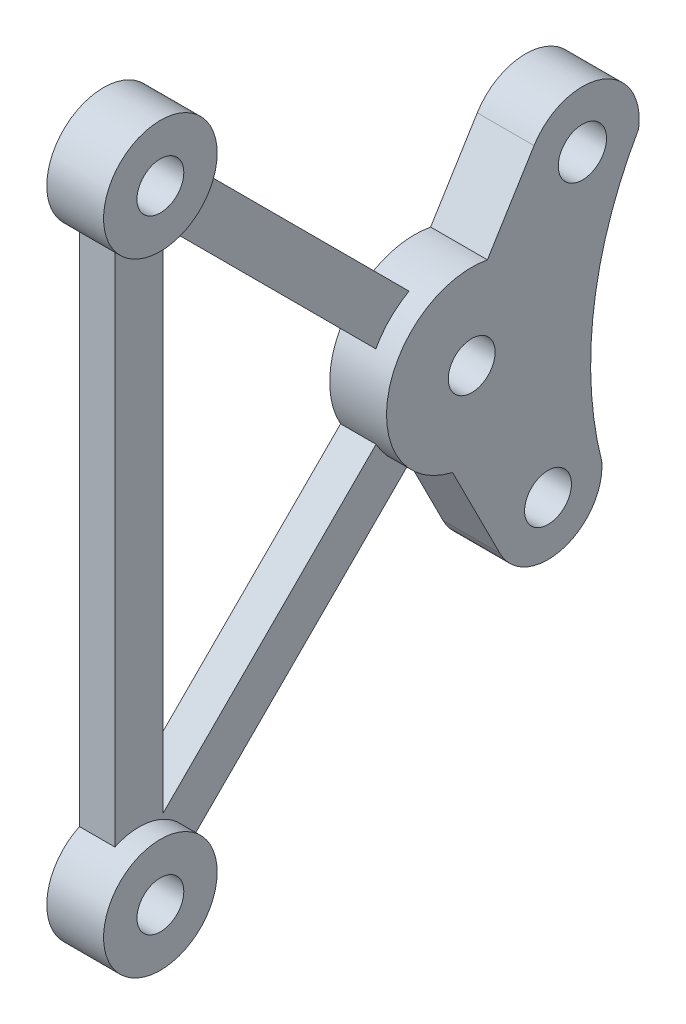
ISO-10303-21;
HEADER;
FILE_DESCRIPTION(('STEP AP214'),'2;1');
FILE_NAME('part.step','',(''),(''),'','','');
FILE_SCHEMA(('AUTOMOTIVE_DESIGN { 1 0 10303 214 1 1 1 1 }'));
ENDSEC;
DATA;
#1=APPLICATION_CONTEXT('core data for automotive mechanical design processes');
#2=APPLICATION_PROTOCOL_DEFINITION('international standard','automotive_design',2000,#1);
#3=PRODUCT_CONTEXT('',#1,'mechanical');
#4=PRODUCT('Part','Part','',(#3));
#5=PRODUCT_RELATED_PRODUCT_CATEGORY('part','',(#4));
#6=PRODUCT_DEFINITION_FORMATION('','',#4);
#7=PRODUCT_DEFINITION_CONTEXT('part definition',#1,'design');
#8=PRODUCT_DEFINITION('design','',#6,#7);
#9=PRODUCT_DEFINITION_SHAPE('','',#8);
#10=(LENGTH_UNIT() NAMED_UNIT(*) SI_UNIT(.MILLI.,.METRE.));
#11=(NAMED_UNIT(*) PLANE_ANGLE_UNIT() SI_UNIT($,.RADIAN.));
#12=(NAMED_UNIT(*) SI_UNIT($,.STERADIAN.) SOLID_ANGLE_UNIT());
#13=UNCERTAINTY_MEASURE_WITH_UNIT(LENGTH_MEASURE(1.E-05),#10,'distance_accuracy_value','');
#14=(GEOMETRIC_REPRESENTATION_CONTEXT(3) GLOBAL_UNCERTAINTY_ASSIGNED_CONTEXT((#13)) GLOBAL_UNIT_ASSIGNED_CONTEXT((#10,
#11,#12)) REPRESENTATION_CONTEXT('',''));
#15=CARTESIAN_POINT('',(0.,0.,0.));
#16=DIRECTION('',(0.,0.,1.));
#17=DIRECTION('',(1.,0.,0.));
#18=AXIS2_PLACEMENT_3D('',#15,#16,#17);
#19=CARTESIAN_POINT('',(7.7,0.,0.));
#20=DIRECTION('',(-1.,0.,0.));
#21=DIRECTION('',(0.,0.,1.));
#22=AXIS2_PLACEMENT_3D('',#19,#20,#21);
#23=PLANE('',#22);
#24=DIRECTION('',(0.,0.851077167042886,-0.525040622940982));
#25=VECTOR('',#24,1.);
#26=CARTESIAN_POINT('',(7.7,15.3011018850537,24.8026874035418));
#27=LINE('',#26,#25);
#28=CARTESIAN_POINT('',(7.7,32.4187106533808,14.242610927504));
#29=VERTEX_POINT('',#28);
#30=CARTESIAN_POINT('',(7.7,37.7439659027633,10.9573913942737));
#31=VERTEX_POINT('',#30);
#32=EDGE_CURVE('E163',#29,#31,#27,.T.);
#33=ORIENTED_EDGE('',*,*,#32,.T.);
#34=CARTESIAN_POINT('',(7.7,35.6438034109994,7.55308272610218));
#35=DIRECTION('',(-1.,0.,0.));
#36=DIRECTION('',(0.,0.,1.));
#37=AXIS2_PLACEMENT_3D('',#34,#35,#36);
#38=CIRCLE('',#37,4.00000000000001);
#39=CARTESIAN_POINT('',(7.7,35.0777791166732,3.59333317616438));
#40=VERTEX_POINT('',#39);
#41=EDGE_CURVE('E153',#31,#40,#38,.T.);
#42=ORIENTED_EDGE('',*,*,#41,.T.);
#43=CARTESIAN_POINT('',(7.7,22.3796583886342,-18.5641875375977));
#44=DIRECTION('',(-1.,0.,0.));
#45=DIRECTION('',(0.,0.,1.));
#46=AXIS2_PLACEMENT_3D('',#43,#44,#45);
#47=CIRCLE('',#46,25.5381674010617);
#48=CARTESIAN_POINT('',(7.7,16.1061997343442,6.19145244034602));
#49=VERTEX_POINT('',#48);
#50=EDGE_CURVE('E161',#40,#49,#47,.F.);
#51=ORIENTED_EDGE('',*,*,#50,.T.);
#52=CARTESIAN_POINT('',(7.7,15.7921957632189,9.97602858641019));
#53=DIRECTION('',(-1.,0.,0.));
#54=DIRECTION('',(0.,0.,1.));
#55=AXIS2_PLACEMENT_3D('',#52,#53,#54);
#56=CIRCLE('',#55,3.79758016363584);
#57=CARTESIAN_POINT('',(7.7,14.0804677214004,13.3659551652748));
#58=VERTEX_POINT('',#57);
#59=EDGE_CURVE('E165',#58,#49,#56,.F.);
#60=ORIENTED_EDGE('',*,*,#59,.F.);
#61=DIRECTION('',(0.,0.892654383263649,0.450741779781057));
#62=VECTOR('',#61,1.);
#63=CARTESIAN_POINT('',(7.7,-2.5171780092854,4.98504927707151));
#64=LINE('',#63,#62);
#65=CARTESIAN_POINT('',(7.7,20.6746451220437,16.6956551180057));
#66=VERTEX_POINT('',#65);
#67=EDGE_CURVE('E179',#58,#66,#64,.T.);
#68=ORIENTED_EDGE('',*,*,#67,.T.);
#69=CARTESIAN_POINT('',(7.7,26.5217412045859,15.3497474683058));
#70=DIRECTION('',(-1.,0.,0.));
#71=DIRECTION('',(0.,0.,1.));
#72=AXIS2_PLACEMENT_3D('',#69,#70,#71);
#73=CIRCLE('',#72,6.);
#74=CARTESIAN_POINT('',(7.7,21.2759526233619,18.2620836716142));
#75=VERTEX_POINT('',#74);
#76=EDGE_CURVE('E236',#66,#75,#73,.T.);
#77=ORIENTED_EDGE('',*,*,#76,.T.);
#78=DIRECTION('',(0.,-0.707106781186548,0.707106781186548));
#79=VECTOR('',#78,1.);
#80=CARTESIAN_POINT('',(7.7,19.769018147488,19.769018147488));
#81=LINE('',#80,#79);
#82=CARTESIAN_POINT('',(7.7,6.00659220251767,33.5314440924584));
#83=VERTEX_POINT('',#82);
#84=EDGE_CURVE('E286',#75,#83,#81,.T.);
#85=ORIENTED_EDGE('',*,*,#84,.T.);
#86=CARTESIAN_POINT('',(7.7,4.59674120458586,37.2747474683058));
#87=DIRECTION('',(-1.,0.,0.));
#88=DIRECTION('',(0.,0.,1.));
#89=AXIS2_PLACEMENT_3D('',#86,#87,#88);
#90=CIRCLE('',#89,4.);
#91=CARTESIAN_POINT('',(7.7,8.21751460263219,38.9747474683058));
#92=VERTEX_POINT('',#91);
#93=EDGE_CURVE('E326',#92,#83,#90,.F.);
#94=ORIENTED_EDGE('',*,*,#93,.F.);
#95=DIRECTION('',(0.,-1.,0.));
#96=VECTOR('',#95,1.);
#97=CARTESIAN_POINT('',(7.7,0.,38.9747474683058));
#98=LINE('',#97,#96);
#99=CARTESIAN_POINT('',(7.7,44.8259678065395,38.9747474683058));
#100=VERTEX_POINT('',#99);
#101=EDGE_CURVE('E283',#100,#92,#98,.T.);
#102=ORIENTED_EDGE('',*,*,#101,.F.);
#103=CARTESIAN_POINT('',(7.7,48.4467412045859,37.2747474683058));
#104=DIRECTION('',(-1.,0.,0.));
#105=DIRECTION('',(0.,0.,1.));
#106=AXIS2_PLACEMENT_3D('',#103,#104,#105);
#107=CIRCLE('',#106,4.);
#108=CARTESIAN_POINT('',(7.7,47.036890206654,33.5314440924584));
#109=VERTEX_POINT('',#108);
#110=EDGE_CURVE('E328',#109,#100,#107,.F.);
#111=ORIENTED_EDGE('',*,*,#110,.F.);
#112=DIRECTION('',(0.,-0.707106781186548,-0.707106781186548));
#113=VECTOR('',#112,1.);
#114=CARTESIAN_POINT('',(7.7,6.75272305709782,-6.75272305709782));
#115=LINE('',#114,#113);
#116=CARTESIAN_POINT('',(7.7,31.7675297858098,18.2620836716142));
#117=VERTEX_POINT('',#116);
#118=EDGE_CURVE('E297',#109,#117,#115,.T.);
#119=ORIENTED_EDGE('',*,*,#118,.T.);
#120=EDGE_CURVE('E245',#117,#29,#73,.T.);
#121=ORIENTED_EDGE('',*,*,#120,.T.);
#122=EDGE_LOOP('',(#33,#42,#51,#60,#68,#77,#85,#94,#102,#111,#119,#121));
#123=FACE_BOUND('',#122,.T.);
#124=CARTESIAN_POINT('',(7.7,15.7921957632189,9.97602858641019));
#125=DIRECTION('',(-1.,0.,0.));
#126=DIRECTION('',(0.,0.,1.));
#127=AXIS2_PLACEMENT_3D('',#124,#125,#126);
#128=CIRCLE('',#127,1.65);
#129=CARTESIAN_POINT('',(7.7,15.7921957632189,11.6260285864102));
#130=VERTEX_POINT('',#129);
#131=EDGE_CURVE('E166',#130,#130,#128,.F.);
#132=ORIENTED_EDGE('',*,*,#131,.T.);
#133=EDGE_LOOP('',(#132));
#134=FACE_BOUND('',#133,.T.);
#135=CARTESIAN_POINT('',(7.7,35.6438034109994,7.55308272610218));
#136=DIRECTION('',(-1.,0.,0.));
#137=DIRECTION('',(0.,0.,1.));
#138=AXIS2_PLACEMENT_3D('',#135,#136,#137);
#139=CIRCLE('',#138,1.7);
#140=CARTESIAN_POINT('',(7.7,35.6438034109994,9.25308272610218));
#141=VERTEX_POINT('',#140);
#142=EDGE_CURVE('E171',#141,#141,#139,.F.);
#143=ORIENTED_EDGE('',*,*,#142,.T.);
#144=EDGE_LOOP('',(#143));
#145=FACE_BOUND('',#144,.T.);
#146=CARTESIAN_POINT('',(7.7,4.59674120458586,37.2747474683058));
#147=DIRECTION('',(-1.,0.,0.));
#148=DIRECTION('',(0.,0.,1.));
#149=AXIS2_PLACEMENT_3D('',#146,#147,#148);
#150=CIRCLE('',#149,1.65);
#151=CARTESIAN_POINT('',(7.7,4.59674120458586,35.6247474683058));
#152=VERTEX_POINT('',#151);
#153=EDGE_CURVE('E299',#152,#152,#150,.F.);
#154=ORIENTED_EDGE('',*,*,#153,.T.);
#155=EDGE_LOOP('',(#154));
#156=FACE_BOUND('',#155,.T.);
#157=CARTESIAN_POINT('',(7.7,48.4467412045859,37.2747474683058));
#158=DIRECTION('',(-1.,0.,0.));
#159=DIRECTION('',(0.,0.,1.));
#160=AXIS2_PLACEMENT_3D('',#157,#158,#159);
#161=CIRCLE('',#160,1.65);
#162=CARTESIAN_POINT('',(7.7,48.4467412045859,35.6247474683058));
#163=VERTEX_POINT('',#162);
#164=EDGE_CURVE('E219',#163,#163,#161,.F.);
#165=ORIENTED_EDGE('',*,*,#164,.T.);
#166=EDGE_LOOP('',(#165));
#167=FACE_BOUND('',#166,.T.);
#168=DIRECTION('',(0.,-0.707106781186547,0.707106781186548));
#169=VECTOR('',#168,1.);
#170=CARTESIAN_POINT('',(7.7,22.0858854249335,22.0858854249335));
#171=LINE('',#170,#169);
#172=CARTESIAN_POINT('',(7.7,23.5881125301496,20.5836583197175));
#173=VERTEX_POINT('',#172);
#174=CARTESIAN_POINT('',(7.7,8.59702338156126,35.5747474683058));
#175=VERTEX_POINT('',#174);
#176=EDGE_CURVE('E289',#173,#175,#171,.T.);
#177=ORIENTED_EDGE('',*,*,#176,.F.);
#178=CARTESIAN_POINT('',(7.7,29.4192451738248,20.6037431618941));
#179=VERTEX_POINT('',#178);
#180=EDGE_CURVE('E243',#173,#179,#73,.T.);
#181=ORIENTED_EDGE('',*,*,#180,.T.);
#182=DIRECTION('',(0.,-0.707106781186548,-0.707106781186548));
#183=VECTOR('',#182,1.);
#184=CARTESIAN_POINT('',(7.7,4.40775100596531,-4.40775100596531));
#185=LINE('',#184,#183);
#186=CARTESIAN_POINT('',(7.7,44.3902494802364,35.5747474683058));
#187=VERTEX_POINT('',#186);
#188=EDGE_CURVE('E295',#187,#179,#185,.T.);
#189=ORIENTED_EDGE('',*,*,#188,.F.);
#190=DIRECTION('',(0.,-1.,0.));
#191=VECTOR('',#190,1.);
#192=CARTESIAN_POINT('',(7.7,0.,35.5747474683058));
#193=LINE('',#192,#191);
#194=EDGE_CURVE('E292',#187,#175,#193,.T.);
#195=ORIENTED_EDGE('',*,*,#194,.T.);
#196=EDGE_LOOP('',(#177,#181,#189,#195));
#197=FACE_BOUND('',#196,.T.);
#198=CARTESIAN_POINT('',(7.7,26.5217412045859,15.3497474683058));
#199=DIRECTION('',(-1.,0.,0.));
#200=DIRECTION('',(0.,0.,1.));
#201=AXIS2_PLACEMENT_3D('',#198,#199,#200);
#202=CIRCLE('',#201,1.65);
#203=CARTESIAN_POINT('',(7.7,26.5217412045859,16.9997474683058));
#204=VERTEX_POINT('',#203);
#205=EDGE_CURVE('E252',#204,#204,#202,.T.);
#206=ORIENTED_EDGE('',*,*,#205,.F.);
#207=EDGE_LOOP('',(#206));
#208=FACE_BOUND('',#207,.T.);
#209=ADVANCED_FACE('F41',(#123,#134,#145,#156,#167,#197,#208),#23,.T.);
#210=CARTESIAN_POINT('',(4.,35.6438034109994,7.55308272610218));
#211=DIRECTION('',(-1.,0.,0.));
#212=DIRECTION('',(0.,0.,1.));
#213=AXIS2_PLACEMENT_3D('',#210,#211,#212);
#214=CYLINDRICAL_SURFACE('',#213,4.00000000000001);
#215=ORIENTED_EDGE('',*,*,#41,.F.);
#216=DIRECTION('',(1.,0.,0.));
#217=VECTOR('',#216,1.);
#218=CARTESIAN_POINT('',(-18.8681269811982,37.7439659027633,10.9573913942737));
#219=LINE('',#218,#217);
#220=CARTESIAN_POINT('',(11.7,37.7439659027633,10.9573913942737));
#221=VERTEX_POINT('',#220);
#222=EDGE_CURVE('E156',#31,#221,#219,.T.);
#223=ORIENTED_EDGE('',*,*,#222,.T.);
#224=CARTESIAN_POINT('',(11.7,35.6438034109994,7.55308272610218));
#225=DIRECTION('',(-1.,0.,0.));
#226=DIRECTION('',(0.,0.,1.));
#227=AXIS2_PLACEMENT_3D('',#224,#225,#226);
#228=CIRCLE('',#227,4.00000000000001);
#229=CARTESIAN_POINT('',(11.7,35.0777791166732,3.59333317616438));
#230=VERTEX_POINT('',#229);
#231=EDGE_CURVE('E11',#221,#230,#228,.T.);
#232=ORIENTED_EDGE('',*,*,#231,.T.);
#233=DIRECTION('',(1.,0.,0.));
#234=VECTOR('',#233,1.);
#235=CARTESIAN_POINT('',(-18.8681269811982,35.0777791166732,3.59333317616438));
#236=LINE('',#235,#234);
#237=EDGE_CURVE('E45',#40,#230,#236,.T.);
#238=ORIENTED_EDGE('',*,*,#237,.F.);
#239=EDGE_LOOP('',(#215,#223,#232,#238));
#240=FACE_BOUND('',#239,.T.);
#241=ADVANCED_FACE('F152',(#240),#214,.T.);
#242=CARTESIAN_POINT('',(-15.4235639409025,15.7921957632189,9.97602858641019));
#243=DIRECTION('',(1.,0.,0.));
#244=DIRECTION('',(0.,0.,-1.));
#245=AXIS2_PLACEMENT_3D('',#242,#243,#244);
#246=CYLINDRICAL_SURFACE('',#245,1.65);
#247=CARTESIAN_POINT('',(11.7,15.7921957632189,9.97602858641019));
#248=DIRECTION('',(1.,0.,0.));
#249=DIRECTION('',(0.,0.,-1.));
#250=AXIS2_PLACEMENT_3D('',#247,#248,#249);
#251=CIRCLE('',#250,1.65);
#252=CARTESIAN_POINT('',(11.7,15.7921957632189,8.3260285864102));
#253=VERTEX_POINT('',#252);
#254=EDGE_CURVE('E212',#253,#253,#251,.T.);
#255=ORIENTED_EDGE('',*,*,#254,.T.);
#256=EDGE_LOOP('',(#255));
#257=FACE_BOUND('',#256,.T.);
#258=ORIENTED_EDGE('',*,*,#131,.F.);
#259=EDGE_LOOP('',(#258));
#260=FACE_BOUND('',#259,.T.);
#261=ADVANCED_FACE('F43',(#257,#260),#246,.F.);
#262=CARTESIAN_POINT('',(-15.4235639409025,-2.5171780092854,4.98504927707151));
#263=DIRECTION('',(0.,0.450741779781057,-0.892654383263649));
#264=DIRECTION('',(0.,0.892654383263649,0.450741779781057));
#265=AXIS2_PLACEMENT_3D('',#262,#263,#264);
#266=PLANE('',#265);
#267=ORIENTED_EDGE('',*,*,#67,.F.);
#268=DIRECTION('',(1.,0.,0.));
#269=VECTOR('',#268,1.);
#270=CARTESIAN_POINT('',(-15.4235639409025,14.0804677214004,13.3659551652748));
#271=LINE('',#270,#269);
#272=CARTESIAN_POINT('',(11.7,14.0804677214004,13.3659551652748));
#273=VERTEX_POINT('',#272);
#274=EDGE_CURVE('E178',#58,#273,#271,.T.);
#275=ORIENTED_EDGE('',*,*,#274,.T.);
#276=DIRECTION('',(0.,0.892654383263649,0.450741779781057));
#277=VECTOR('',#276,1.);
#278=CARTESIAN_POINT('',(11.7,-2.5171780092854,4.98504927707151));
#279=LINE('',#278,#277);
#280=CARTESIAN_POINT('',(11.7,20.6746451220437,16.6956551180057));
#281=VERTEX_POINT('',#280);
#282=EDGE_CURVE('E180',#273,#281,#279,.T.);
#283=ORIENTED_EDGE('',*,*,#282,.T.);
#284=DIRECTION('',(1.,0.,0.));
#285=VECTOR('',#284,1.);
#286=CARTESIAN_POINT('',(-15.4235639409025,20.6746451220437,16.6956551180057));
#287=LINE('',#286,#285);
#288=EDGE_CURVE('E214',#66,#281,#287,.T.);
#289=ORIENTED_EDGE('',*,*,#288,.F.);
#290=EDGE_LOOP('',(#267,#275,#283,#289));
#291=FACE_BOUND('',#290,.T.);
#292=ADVANCED_FACE('F200',(#291),#266,.F.);
#293=CARTESIAN_POINT('',(-15.4235639409025,15.7921957632189,9.97602858641019));
#294=DIRECTION('',(1.,0.,0.));
#295=DIRECTION('',(0.,0.,-1.));
#296=AXIS2_PLACEMENT_3D('',#293,#294,#295);
#297=CYLINDRICAL_SURFACE('',#296,3.79758016363584);
#298=ORIENTED_EDGE('',*,*,#274,.F.);
#299=ORIENTED_EDGE('',*,*,#59,.T.);
#300=DIRECTION('',(1.,0.,0.));
#301=VECTOR('',#300,1.);
#302=CARTESIAN_POINT('',(7.85,16.1061997343442,6.19145244034602));
#303=LINE('',#302,#301);
#304=CARTESIAN_POINT('',(11.7,16.1061997343441,6.191452440346));
#305=VERTEX_POINT('',#304);
#306=EDGE_CURVE('E169',#305,#49,#303,.F.);
#307=ORIENTED_EDGE('',*,*,#306,.F.);
#308=CARTESIAN_POINT('',(11.7,15.7921957632189,9.97602858641019));
#309=DIRECTION('',(1.,0.,0.));
#310=DIRECTION('',(0.,0.,-1.));
#311=AXIS2_PLACEMENT_3D('',#308,#309,#310);
#312=CIRCLE('',#311,3.79758016363584);
#313=EDGE_CURVE('E215',#273,#305,#312,.T.);
#314=ORIENTED_EDGE('',*,*,#313,.F.);
#315=EDGE_LOOP('',(#298,#299,#307,#314));
#316=FACE_BOUND('',#315,.T.);
#317=ADVANCED_FACE('F206',(#316),#297,.T.);
#318=CARTESIAN_POINT('',(-18.8681269811982,35.6438034109994,7.55308272610218));
#319=DIRECTION('',(1.,0.,0.));
#320=DIRECTION('',(0.,0.,-1.));
#321=AXIS2_PLACEMENT_3D('',#318,#319,#320);
#322=CYLINDRICAL_SURFACE('',#321,1.7);
#323=CARTESIAN_POINT('',(11.7,35.6438034109994,7.55308272610218));
#324=DIRECTION('',(-1.,0.,0.));
#325=DIRECTION('',(0.,0.,1.));
#326=AXIS2_PLACEMENT_3D('',#323,#324,#325);
#327=CIRCLE('',#326,1.7);
#328=CARTESIAN_POINT('',(11.7,35.6438034109994,9.25308272610218));
#329=VERTEX_POINT('',#328);
#330=EDGE_CURVE('E155',#329,#329,#327,.T.);
#331=ORIENTED_EDGE('',*,*,#330,.F.);
#332=EDGE_LOOP('',(#331));
#333=FACE_BOUND('',#332,.T.);
#334=ORIENTED_EDGE('',*,*,#142,.F.);
#335=EDGE_LOOP('',(#334));
#336=FACE_BOUND('',#335,.T.);
#337=ADVANCED_FACE('F366',(#333,#336),#322,.F.);
#338=CARTESIAN_POINT('',(-18.8681269811982,15.3011018850537,24.8026874035418));
#339=DIRECTION('',(0.,-0.525040622940982,-0.851077167042886));
#340=DIRECTION('',(0.,0.851077167042886,-0.525040622940982));
#341=AXIS2_PLACEMENT_3D('',#338,#339,#340);
#342=PLANE('',#341);
#343=ORIENTED_EDGE('',*,*,#222,.F.);
#344=ORIENTED_EDGE('',*,*,#32,.F.);
#345=DIRECTION('',(1.,0.,0.));
#346=VECTOR('',#345,1.);
#347=CARTESIAN_POINT('',(-18.8681269811982,32.4187106533808,14.242610927504));
#348=LINE('',#347,#346);
#349=CARTESIAN_POINT('',(11.7,32.4187106533808,14.242610927504));
#350=VERTEX_POINT('',#349);
#351=EDGE_CURVE('E181',#29,#350,#348,.T.);
#352=ORIENTED_EDGE('',*,*,#351,.T.);
#353=DIRECTION('',(0.,-0.851077167042886,0.525040622940983));
#354=VECTOR('',#353,1.);
#355=CARTESIAN_POINT('',(11.7,15.3011018850537,24.8026874035418));
#356=LINE('',#355,#354);
#357=EDGE_CURVE('E192',#221,#350,#356,.T.);
#358=ORIENTED_EDGE('',*,*,#357,.F.);
#359=EDGE_LOOP('',(#343,#344,#352,#358));
#360=FACE_BOUND('',#359,.T.);
#361=ADVANCED_FACE('F363',(#360),#342,.F.);
#362=CARTESIAN_POINT('',(-18.8681269811982,22.3796583886342,-18.5641875375977));
#363=DIRECTION('',(1.,0.,0.));
#364=DIRECTION('',(0.,0.,-1.));
#365=AXIS2_PLACEMENT_3D('',#362,#363,#364);
#366=CYLINDRICAL_SURFACE('',#365,25.5381674010617);
#367=ORIENTED_EDGE('',*,*,#50,.F.);
#368=ORIENTED_EDGE('',*,*,#237,.T.);
#369=CARTESIAN_POINT('',(11.7,22.3796583886342,-18.5641875375977));
#370=DIRECTION('',(-1.,0.,0.));
#371=DIRECTION('',(0.,0.,1.));
#372=AXIS2_PLACEMENT_3D('',#369,#370,#371);
#373=CIRCLE('',#372,25.5381674010617);
#374=EDGE_CURVE('E50',#305,#230,#373,.T.);
#375=ORIENTED_EDGE('',*,*,#374,.F.);
#376=ORIENTED_EDGE('',*,*,#306,.T.);
#377=EDGE_LOOP('',(#367,#368,#375,#376));
#378=FACE_BOUND('',#377,.T.);
#379=ADVANCED_FACE('F168',(#378),#366,.F.);
#380=CARTESIAN_POINT('',(11.7,26.5217412045859,15.3497474683058));
#381=DIRECTION('',(-1.,0.,0.));
#382=DIRECTION('',(0.,0.,1.));
#383=AXIS2_PLACEMENT_3D('',#380,#381,#382);
#384=CYLINDRICAL_SURFACE('',#383,6.);
#385=CARTESIAN_POINT('',(11.7,26.5217412045859,15.3497474683058));
#386=DIRECTION('',(-1.,0.,0.));
#387=DIRECTION('',(0.,0.,1.));
#388=AXIS2_PLACEMENT_3D('',#385,#386,#387);
#389=CIRCLE('',#388,6.);
#390=EDGE_CURVE('E232',#281,#350,#389,.T.);
#391=ORIENTED_EDGE('',*,*,#390,.T.);
#392=ORIENTED_EDGE('',*,*,#351,.F.);
#393=ORIENTED_EDGE('',*,*,#120,.F.);
#394=DIRECTION('',(-1.,0.,0.));
#395=VECTOR('',#394,1.);
#396=CARTESIAN_POINT('',(10.2,31.7675297858098,18.2620836716142));
#397=LINE('',#396,#395);
#398=CARTESIAN_POINT('',(10.2,31.7675297858098,18.2620836716142));
#399=VERTEX_POINT('',#398);
#400=EDGE_CURVE('E262',#399,#117,#397,.T.);
#401=ORIENTED_EDGE('',*,*,#400,.F.);
#402=CARTESIAN_POINT('',(10.2,26.5217412045859,15.3497474683058));
#403=DIRECTION('',(-1.,0.,0.));
#404=DIRECTION('',(0.,0.,1.));
#405=AXIS2_PLACEMENT_3D('',#402,#403,#404);
#406=CIRCLE('',#405,6.);
#407=CARTESIAN_POINT('',(10.2,29.4192451738248,20.6037431618941));
#408=VERTEX_POINT('',#407);
#409=EDGE_CURVE('E316',#408,#399,#406,.T.);
#410=ORIENTED_EDGE('',*,*,#409,.F.);
#411=DIRECTION('',(-1.,0.,0.));
#412=VECTOR('',#411,1.);
#413=CARTESIAN_POINT('',(10.2,29.4192451738248,20.6037431618941));
#414=LINE('',#413,#412);
#415=EDGE_CURVE('E265',#408,#179,#414,.T.);
#416=ORIENTED_EDGE('',*,*,#415,.T.);
#417=ORIENTED_EDGE('',*,*,#180,.F.);
#418=DIRECTION('',(-1.,0.,0.));
#419=VECTOR('',#418,1.);
#420=CARTESIAN_POINT('',(10.2,23.5881125301496,20.5836583197175));
#421=LINE('',#420,#419);
#422=CARTESIAN_POINT('',(10.2,23.5881125301496,20.5836583197175));
#423=VERTEX_POINT('',#422);
#424=EDGE_CURVE('E272',#423,#173,#421,.T.);
#425=ORIENTED_EDGE('',*,*,#424,.F.);
#426=CARTESIAN_POINT('',(10.2,21.2759526233619,18.2620836716142));
#427=VERTEX_POINT('',#426);
#428=EDGE_CURVE('E308',#427,#423,#406,.T.);
#429=ORIENTED_EDGE('',*,*,#428,.F.);
#430=DIRECTION('',(-1.,0.,0.));
#431=VECTOR('',#430,1.);
#432=CARTESIAN_POINT('',(10.2,21.2759526233619,18.2620836716142));
#433=LINE('',#432,#431);
#434=EDGE_CURVE('E242',#427,#75,#433,.T.);
#435=ORIENTED_EDGE('',*,*,#434,.T.);
#436=ORIENTED_EDGE('',*,*,#76,.F.);
#437=ORIENTED_EDGE('',*,*,#288,.T.);
#438=EDGE_LOOP('',(#391,#392,#393,#401,#410,#416,#417,#425,#429,#435,#436,#437));
#439=FACE_BOUND('',#438,.T.);
#440=ADVANCED_FACE('F240',(#439),#384,.T.);
#441=CARTESIAN_POINT('',(11.7,26.5217412045859,15.3497474683058));
#442=DIRECTION('',(-1.,0.,0.));
#443=DIRECTION('',(0.,0.,1.));
#444=AXIS2_PLACEMENT_3D('',#441,#442,#443);
#445=PLANE('',#444);
#446=ORIENTED_EDGE('',*,*,#313,.T.);
#447=ORIENTED_EDGE('',*,*,#374,.T.);
#448=ORIENTED_EDGE('',*,*,#231,.F.);
#449=ORIENTED_EDGE('',*,*,#357,.T.);
#450=ORIENTED_EDGE('',*,*,#390,.F.);
#451=ORIENTED_EDGE('',*,*,#282,.F.);
#452=EDGE_LOOP('',(#446,#447,#448,#449,#450,#451));
#453=FACE_BOUND('',#452,.T.);
#454=CARTESIAN_POINT('',(11.7,26.5217412045859,15.3497474683058));
#455=DIRECTION('',(-1.,0.,0.));
#456=DIRECTION('',(0.,0.,1.));
#457=AXIS2_PLACEMENT_3D('',#454,#455,#456);
#458=CIRCLE('',#457,1.65);
#459=CARTESIAN_POINT('',(11.7,26.5217412045859,16.9997474683058));
#460=VERTEX_POINT('',#459);
#461=EDGE_CURVE('E249',#460,#460,#458,.T.);
#462=ORIENTED_EDGE('',*,*,#461,.T.);
#463=EDGE_LOOP('',(#462));
#464=FACE_BOUND('',#463,.T.);
#465=ORIENTED_EDGE('',*,*,#254,.F.);
#466=EDGE_LOOP('',(#465));
#467=FACE_BOUND('',#466,.T.);
#468=ORIENTED_EDGE('',*,*,#330,.T.);
#469=EDGE_LOOP('',(#468));
#470=FACE_BOUND('',#469,.T.);
#471=ADVANCED_FACE('F229',(#453,#464,#467,#470),#445,.F.);
#472=CARTESIAN_POINT('',(11.7,26.5217412045859,15.3497474683058));
#473=DIRECTION('',(-1.,0.,0.));
#474=DIRECTION('',(0.,0.,1.));
#475=AXIS2_PLACEMENT_3D('',#472,#473,#474);
#476=CYLINDRICAL_SURFACE('',#475,1.65);
#477=ORIENTED_EDGE('',*,*,#461,.F.);
#478=EDGE_LOOP('',(#477));
#479=FACE_BOUND('',#478,.T.);
#480=ORIENTED_EDGE('',*,*,#205,.T.);
#481=EDGE_LOOP('',(#480));
#482=FACE_BOUND('',#481,.T.);
#483=ADVANCED_FACE('F403',(#479,#482),#476,.F.);
#484=CARTESIAN_POINT('',(10.2,0.,38.9747474683058));
#485=DIRECTION('',(0.,0.,-1.));
#486=DIRECTION('',(-1.,0.,0.));
#487=AXIS2_PLACEMENT_3D('',#484,#485,#486);
#488=PLANE('',#487);
#489=ORIENTED_EDGE('',*,*,#101,.T.);
#490=DIRECTION('',(-1.,0.,0.));
#491=VECTOR('',#490,1.);
#492=CARTESIAN_POINT('',(10.2,8.2175146026322,38.9747474683058));
#493=LINE('',#492,#491);
#494=CARTESIAN_POINT('',(10.2,8.21751460263219,38.9747474683058));
#495=VERTEX_POINT('',#494);
#496=EDGE_CURVE('E279',#495,#92,#493,.T.);
#497=ORIENTED_EDGE('',*,*,#496,.F.);
#498=DIRECTION('',(0.,-1.,0.));
#499=VECTOR('',#498,1.);
#500=CARTESIAN_POINT('',(10.2,0.,38.9747474683058));
#501=LINE('',#500,#499);
#502=CARTESIAN_POINT('',(10.2,44.8259678065395,38.9747474683058));
#503=VERTEX_POINT('',#502);
#504=EDGE_CURVE('E261',#503,#495,#501,.T.);
#505=ORIENTED_EDGE('',*,*,#504,.F.);
#506=DIRECTION('',(-1.,0.,0.));
#507=VECTOR('',#506,1.);
#508=CARTESIAN_POINT('',(10.2,44.8259678065395,38.9747474683058));
#509=LINE('',#508,#507);
#510=EDGE_CURVE('E256',#503,#100,#509,.T.);
#511=ORIENTED_EDGE('',*,*,#510,.T.);
#512=EDGE_LOOP('',(#489,#497,#505,#511));
#513=FACE_BOUND('',#512,.T.);
#514=ADVANCED_FACE('F399',(#513),#488,.F.);
#515=CARTESIAN_POINT('',(10.2,19.769018147488,19.769018147488));
#516=DIRECTION('',(0.,-0.707106781186548,-0.707106781186548));
#517=DIRECTION('',(0.,0.707106781186548,-0.707106781186548));
#518=AXIS2_PLACEMENT_3D('',#515,#516,#517);
#519=PLANE('',#518);
#520=ORIENTED_EDGE('',*,*,#84,.F.);
#521=ORIENTED_EDGE('',*,*,#434,.F.);
#522=DIRECTION('',(0.,-0.707106781186548,0.707106781186548));
#523=VECTOR('',#522,1.);
#524=CARTESIAN_POINT('',(10.2,19.769018147488,19.769018147488));
#525=LINE('',#524,#523);
#526=CARTESIAN_POINT('',(10.2,6.00659220251767,33.5314440924584));
#527=VERTEX_POINT('',#526);
#528=EDGE_CURVE('E305',#427,#527,#525,.T.);
#529=ORIENTED_EDGE('',*,*,#528,.T.);
#530=DIRECTION('',(-1.,0.,0.));
#531=VECTOR('',#530,1.);
#532=CARTESIAN_POINT('',(10.2,6.00659220251767,33.5314440924584));
#533=LINE('',#532,#531);
#534=EDGE_CURVE('E276',#527,#83,#533,.T.);
#535=ORIENTED_EDGE('',*,*,#534,.T.);
#536=EDGE_LOOP('',(#520,#521,#529,#535));
#537=FACE_BOUND('',#536,.T.);
#538=ADVANCED_FACE('F402',(#537),#519,.T.);
#539=CARTESIAN_POINT('',(10.2,22.0858854249335,22.0858854249335));
#540=DIRECTION('',(0.,-0.707106781186548,-0.707106781186547));
#541=DIRECTION('',(0.,0.707106781186547,-0.707106781186548));
#542=AXIS2_PLACEMENT_3D('',#539,#540,#541);
#543=PLANE('',#542);
#544=ORIENTED_EDGE('',*,*,#176,.T.);
#545=DIRECTION('',(-1.,0.,0.));
#546=VECTOR('',#545,1.);
#547=CARTESIAN_POINT('',(10.2,8.59702338156126,35.5747474683058));
#548=LINE('',#547,#546);
#549=CARTESIAN_POINT('',(10.2,8.59702338156126,35.5747474683058));
#550=VERTEX_POINT('',#549);
#551=EDGE_CURVE('E270',#550,#175,#548,.T.);
#552=ORIENTED_EDGE('',*,*,#551,.F.);
#553=DIRECTION('',(0.,-0.707106781186547,0.707106781186548));
#554=VECTOR('',#553,1.);
#555=CARTESIAN_POINT('',(10.2,22.0858854249335,22.0858854249335));
#556=LINE('',#555,#554);
#557=EDGE_CURVE('E309',#423,#550,#556,.T.);
#558=ORIENTED_EDGE('',*,*,#557,.F.);
#559=ORIENTED_EDGE('',*,*,#424,.T.);
#560=EDGE_LOOP('',(#544,#552,#558,#559));
#561=FACE_BOUND('',#560,.T.);
#562=ADVANCED_FACE('F407',(#561),#543,.F.);
#563=CARTESIAN_POINT('',(10.2,0.,35.5747474683058));
#564=DIRECTION('',(0.,0.,-1.));
#565=DIRECTION('',(-1.,0.,0.));
#566=AXIS2_PLACEMENT_3D('',#563,#564,#565);
#567=PLANE('',#566);
#568=ORIENTED_EDGE('',*,*,#194,.F.);
#569=DIRECTION('',(-1.,0.,0.));
#570=VECTOR('',#569,1.);
#571=CARTESIAN_POINT('',(10.2,44.3902494802364,35.5747474683058));
#572=LINE('',#571,#570);
#573=CARTESIAN_POINT('',(10.2,44.3902494802364,35.5747474683058));
#574=VERTEX_POINT('',#573);
#575=EDGE_CURVE('E268',#574,#187,#572,.T.);
#576=ORIENTED_EDGE('',*,*,#575,.F.);
#577=DIRECTION('',(0.,-1.,0.));
#578=VECTOR('',#577,1.);
#579=CARTESIAN_POINT('',(10.2,0.,35.5747474683058));
#580=LINE('',#579,#578);
#581=EDGE_CURVE('E311',#574,#550,#580,.T.);
#582=ORIENTED_EDGE('',*,*,#581,.T.);
#583=ORIENTED_EDGE('',*,*,#551,.T.);
#584=EDGE_LOOP('',(#568,#576,#582,#583));
#585=FACE_BOUND('',#584,.T.);
#586=ADVANCED_FACE('F411',(#585),#567,.T.);
#587=CARTESIAN_POINT('',(10.2,4.40775100596531,-4.40775100596531));
#588=DIRECTION('',(0.,0.707106781186548,-0.707106781186548));
#589=DIRECTION('',(0.,0.707106781186548,0.707106781186548));
#590=AXIS2_PLACEMENT_3D('',#587,#588,#589);
#591=PLANE('',#590);
#592=ORIENTED_EDGE('',*,*,#188,.T.);
#593=ORIENTED_EDGE('',*,*,#415,.F.);
#594=DIRECTION('',(0.,-0.707106781186548,-0.707106781186548));
#595=VECTOR('',#594,1.);
#596=CARTESIAN_POINT('',(10.2,4.40775100596531,-4.40775100596531));
#597=LINE('',#596,#595);
#598=EDGE_CURVE('E314',#574,#408,#597,.T.);
#599=ORIENTED_EDGE('',*,*,#598,.F.);
#600=ORIENTED_EDGE('',*,*,#575,.T.);
#601=EDGE_LOOP('',(#592,#593,#599,#600));
#602=FACE_BOUND('',#601,.T.);
#603=ADVANCED_FACE('F415',(#602),#591,.F.);
#604=CARTESIAN_POINT('',(10.2,6.75272305709782,-6.75272305709782));
#605=DIRECTION('',(0.,0.707106781186548,-0.707106781186548));
#606=DIRECTION('',(0.,0.707106781186548,0.707106781186548));
#607=AXIS2_PLACEMENT_3D('',#604,#605,#606);
#608=PLANE('',#607);
#609=ORIENTED_EDGE('',*,*,#118,.F.);
#610=DIRECTION('',(-1.,0.,0.));
#611=VECTOR('',#610,1.);
#612=CARTESIAN_POINT('',(10.2,47.036890206654,33.5314440924584));
#613=LINE('',#612,#611);
#614=CARTESIAN_POINT('',(10.2,47.036890206654,33.5314440924584));
#615=VERTEX_POINT('',#614);
#616=EDGE_CURVE('E259',#615,#109,#613,.T.);
#617=ORIENTED_EDGE('',*,*,#616,.F.);
#618=DIRECTION('',(0.,-0.707106781186548,-0.707106781186548));
#619=VECTOR('',#618,1.);
#620=CARTESIAN_POINT('',(10.2,6.75272305709782,-6.75272305709782));
#621=LINE('',#620,#619);
#622=EDGE_CURVE('E318',#615,#399,#621,.T.);
#623=ORIENTED_EDGE('',*,*,#622,.T.);
#624=ORIENTED_EDGE('',*,*,#400,.T.);
#625=EDGE_LOOP('',(#609,#617,#623,#624));
#626=FACE_BOUND('',#625,.T.);
#627=ADVANCED_FACE('F397',(#626),#608,.T.);
#628=CARTESIAN_POINT('',(10.2,0.,0.));
#629=DIRECTION('',(-1.,0.,0.));
#630=DIRECTION('',(0.,0.,1.));
#631=AXIS2_PLACEMENT_3D('',#628,#629,#630);
#632=PLANE('',#631);
#633=CARTESIAN_POINT('',(10.2,48.4467412045859,37.2747474683058));
#634=DIRECTION('',(-1.,0.,0.));
#635=DIRECTION('',(0.,0.,1.));
#636=AXIS2_PLACEMENT_3D('',#633,#634,#635);
#637=CIRCLE('',#636,4.);
#638=EDGE_CURVE('E287',#615,#503,#637,.T.);
#639=ORIENTED_EDGE('',*,*,#638,.T.);
#640=ORIENTED_EDGE('',*,*,#504,.T.);
#641=CARTESIAN_POINT('',(10.2,4.59674120458586,37.2747474683058));
#642=DIRECTION('',(-1.,0.,0.));
#643=DIRECTION('',(0.,0.,1.));
#644=AXIS2_PLACEMENT_3D('',#641,#642,#643);
#645=CIRCLE('',#644,4.);
#646=EDGE_CURVE('E302',#495,#527,#645,.T.);
#647=ORIENTED_EDGE('',*,*,#646,.T.);
#648=ORIENTED_EDGE('',*,*,#528,.F.);
#649=ORIENTED_EDGE('',*,*,#428,.T.);
#650=ORIENTED_EDGE('',*,*,#557,.T.);
#651=ORIENTED_EDGE('',*,*,#581,.F.);
#652=ORIENTED_EDGE('',*,*,#598,.T.);
#653=ORIENTED_EDGE('',*,*,#409,.T.);
#654=ORIENTED_EDGE('',*,*,#622,.F.);
#655=EDGE_LOOP('',(#639,#640,#647,#648,#649,#650,#651,#652,#653,#654));
#656=FACE_BOUND('',#655,.T.);
#657=ADVANCED_FACE('F391',(#656),#632,.F.);
#658=CARTESIAN_POINT('',(-3.61370849898477,4.59674120458586,37.2747474683058));
#659=DIRECTION('',(1.,0.,0.));
#660=DIRECTION('',(0.,0.,-1.));
#661=AXIS2_PLACEMENT_3D('',#658,#659,#660);
#662=CYLINDRICAL_SURFACE('',#661,4.);
#663=CARTESIAN_POINT('',(11.7,4.59674120458586,37.2747474683058));
#664=DIRECTION('',(1.,0.,0.));
#665=DIRECTION('',(0.,0.,-1.));
#666=AXIS2_PLACEMENT_3D('',#663,#664,#665);
#667=CIRCLE('',#666,4.);
#668=CARTESIAN_POINT('',(11.7,4.59674120458586,33.2747474683058));
#669=VERTEX_POINT('',#668);
#670=EDGE_CURVE('E325',#669,#669,#667,.T.);
#671=ORIENTED_EDGE('',*,*,#670,.F.);
#672=EDGE_LOOP('',(#671));
#673=FACE_BOUND('',#672,.T.);
#674=ORIENTED_EDGE('',*,*,#496,.T.);
#675=ORIENTED_EDGE('',*,*,#93,.T.);
#676=ORIENTED_EDGE('',*,*,#534,.F.);
#677=ORIENTED_EDGE('',*,*,#646,.F.);
#678=EDGE_LOOP('',(#674,#675,#676,#677));
#679=FACE_BOUND('',#678,.T.);
#680=ADVANCED_FACE('F382',(#673,#679),#662,.T.);
#681=CARTESIAN_POINT('',(-3.61370849898477,4.59674120458586,37.2747474683058));
#682=DIRECTION('',(1.,0.,0.));
#683=DIRECTION('',(0.,0.,-1.));
#684=AXIS2_PLACEMENT_3D('',#681,#682,#683);
#685=CYLINDRICAL_SURFACE('',#684,1.65);
#686=CARTESIAN_POINT('',(11.7,4.59674120458586,37.2747474683058));
#687=DIRECTION('',(1.,0.,0.));
#688=DIRECTION('',(0.,0.,-1.));
#689=AXIS2_PLACEMENT_3D('',#686,#687,#688);
#690=CIRCLE('',#689,1.65);
#691=CARTESIAN_POINT('',(11.7,4.59674120458586,35.6247474683058));
#692=VERTEX_POINT('',#691);
#693=EDGE_CURVE('E329',#692,#692,#690,.T.);
#694=CARTESIAN_POINT('',(11.7,4.59674120458586,35.6247474683058));
#695=CARTESIAN_POINT('',(11.6583333333333,4.59674120458586,35.6247474683058));
#696=CARTESIAN_POINT('',(11.6166666666667,4.59674120458586,35.6247474683058));
#697=CARTESIAN_POINT('',(11.5333333333333,4.59674120458586,35.6247474683058));
#698=CARTESIAN_POINT('',(11.4916666666667,4.59674120458586,35.6247474683058));
#699=CARTESIAN_POINT('',(11.4083333333333,4.59674120458586,35.6247474683058));
#700=CARTESIAN_POINT('',(11.3666666666667,4.59674120458586,35.6247474683058));
#701=CARTESIAN_POINT('',(11.2833333333333,4.59674120458586,35.6247474683058));
#702=CARTESIAN_POINT('',(11.2416666666667,4.59674120458586,35.6247474683058));
#703=CARTESIAN_POINT('',(11.1583333333333,4.59674120458586,35.6247474683058));
#704=CARTESIAN_POINT('',(11.1166666666667,4.59674120458586,35.6247474683058));
#705=CARTESIAN_POINT('',(11.0333333333333,4.59674120458586,35.6247474683058));
#706=CARTESIAN_POINT('',(10.9916666666667,4.59674120458586,35.6247474683058));
#707=CARTESIAN_POINT('',(10.9083333333333,4.59674120458586,35.6247474683058));
#708=CARTESIAN_POINT('',(10.8666666666667,4.59674120458586,35.6247474683058));
#709=CARTESIAN_POINT('',(10.7833333333333,4.59674120458586,35.6247474683058));
#710=CARTESIAN_POINT('',(10.7416666666667,4.59674120458586,35.6247474683058));
#711=CARTESIAN_POINT('',(10.6583333333333,4.59674120458586,35.6247474683058));
#712=CARTESIAN_POINT('',(10.6166666666667,4.59674120458586,35.6247474683058));
#713=CARTESIAN_POINT('',(10.5333333333333,4.59674120458586,35.6247474683058));
#714=CARTESIAN_POINT('',(10.4916666666667,4.59674120458586,35.6247474683058));
#715=CARTESIAN_POINT('',(10.4083333333333,4.59674120458586,35.6247474683058));
#716=CARTESIAN_POINT('',(10.3666666666667,4.59674120458586,35.6247474683058));
#717=CARTESIAN_POINT('',(10.2833333333333,4.59674120458586,35.6247474683058));
#718=CARTESIAN_POINT('',(10.2416666666667,4.59674120458586,35.6247474683058));
#719=CARTESIAN_POINT('',(10.1583333333333,4.59674120458586,35.6247474683058));
#720=CARTESIAN_POINT('',(10.1166666666667,4.59674120458586,35.6247474683058));
#721=CARTESIAN_POINT('',(10.0333333333333,4.59674120458586,35.6247474683058));
#722=CARTESIAN_POINT('',(9.99166666666667,4.59674120458586,35.6247474683058));
#723=CARTESIAN_POINT('',(9.90833333333333,4.59674120458586,35.6247474683058));
#724=CARTESIAN_POINT('',(9.86666666666667,4.59674120458586,35.6247474683058));
#725=CARTESIAN_POINT('',(9.78333333333333,4.59674120458586,35.6247474683058));
#726=CARTESIAN_POINT('',(9.74166666666667,4.59674120458586,35.6247474683058));
#727=CARTESIAN_POINT('',(9.65833333333333,4.59674120458586,35.6247474683058));
#728=CARTESIAN_POINT('',(9.61666666666667,4.59674120458586,35.6247474683058));
#729=CARTESIAN_POINT('',(9.53333333333333,4.59674120458586,35.6247474683058));
#730=CARTESIAN_POINT('',(9.49166666666667,4.59674120458586,35.6247474683058));
#731=CARTESIAN_POINT('',(9.40833333333333,4.59674120458586,35.6247474683058));
#732=CARTESIAN_POINT('',(9.36666666666667,4.59674120458586,35.6247474683058));
#733=CARTESIAN_POINT('',(9.28333333333333,4.59674120458586,35.6247474683058));
#734=CARTESIAN_POINT('',(9.24166666666667,4.59674120458586,35.6247474683058));
#735=CARTESIAN_POINT('',(9.15833333333333,4.59674120458586,35.6247474683058));
#736=CARTESIAN_POINT('',(9.11666666666667,4.59674120458586,35.6247474683058));
#737=CARTESIAN_POINT('',(9.03333333333333,4.59674120458586,35.6247474683058));
#738=CARTESIAN_POINT('',(8.99166666666667,4.59674120458586,35.6247474683058));
#739=CARTESIAN_POINT('',(8.90833333333333,4.59674120458586,35.6247474683058));
#740=CARTESIAN_POINT('',(8.86666666666667,4.59674120458586,35.6247474683058));
#741=CARTESIAN_POINT('',(8.78333333333333,4.59674120458586,35.6247474683058));
#742=CARTESIAN_POINT('',(8.74166666666667,4.59674120458586,35.6247474683058));
#743=CARTESIAN_POINT('',(8.65833333333333,4.59674120458586,35.6247474683058));
#744=CARTESIAN_POINT('',(8.61666666666667,4.59674120458586,35.6247474683058));
#745=CARTESIAN_POINT('',(8.53333333333333,4.59674120458586,35.6247474683058));
#746=CARTESIAN_POINT('',(8.49166666666667,4.59674120458586,35.6247474683058));
#747=CARTESIAN_POINT('',(8.40833333333333,4.59674120458586,35.6247474683058));
#748=CARTESIAN_POINT('',(8.36666666666667,4.59674120458586,35.6247474683058));
#749=CARTESIAN_POINT('',(8.28333333333333,4.59674120458586,35.6247474683058));
#750=CARTESIAN_POINT('',(8.24166666666667,4.59674120458586,35.6247474683058));
#751=CARTESIAN_POINT('',(8.15833333333333,4.59674120458586,35.6247474683058));
#752=CARTESIAN_POINT('',(8.11666666666667,4.59674120458586,35.6247474683058));
#753=CARTESIAN_POINT('',(8.03333333333333,4.59674120458586,35.6247474683058));
#754=CARTESIAN_POINT('',(7.99166666666667,4.59674120458586,35.6247474683058));
#755=CARTESIAN_POINT('',(7.90833333333333,4.59674120458586,35.6247474683058));
#756=CARTESIAN_POINT('',(7.86666666666667,4.59674120458586,35.6247474683058));
#757=CARTESIAN_POINT('',(7.78333333333334,4.59674120458586,35.6247474683058));
#758=CARTESIAN_POINT('',(7.74166666666667,4.59674120458586,35.6247474683058));
#759=CARTESIAN_POINT('',(7.7,4.59674120458586,35.6247474683058));
#760=B_SPLINE_CURVE_WITH_KNOTS('',3,(#694,#695,#696,#697,#698,#699,#700,#701,#702,#703,#704,
#705,#706,#707,#708,#709,#710,#711,#712,#713,#714,#715,#716,#717,#718,#719,#720,#721,#722,#723,
#724,#725,#726,#727,#728,#729,#730,#731,#732,#733,#734,#735,#736,#737,#738,#739,#740,#741,#742,
#743,#744,#745,#746,#747,#748,#749,#750,#751,#752,#753,#754,#755,#756,#757,#758,#759),
.UNSPECIFIED.,.F.,.F.,(4,2,2,2,2,2,2,2,2,2,2,2,2,2,2,2,2,2,2,2,2,2,2,2,2,2,2,2,2,2,2,2,4),(0.,
0.125,0.25,0.375,0.5,0.624999999999999,0.749999999999999,0.874999999999999,0.999999999999999,
1.125,1.25,1.375,1.5,1.625,1.75,1.875,2.,2.125,2.25,2.375,2.5,2.625,2.75,2.875,3.,3.125,3.25,
3.375,3.5,3.625,3.75,3.875,4.),.UNSPECIFIED.);
#761=EDGE_CURVE('BSEAM380',#692,#152,#760,.T.);
#762=ORIENTED_EDGE('',*,*,#693,.T.);
#763=ORIENTED_EDGE('',*,*,#153,.F.);
#764=ORIENTED_EDGE('',*,*,#761,.T.);
#765=ORIENTED_EDGE('',*,*,#761,.F.);
#766=EDGE_LOOP('',(#762,#764,#763,#765));
#767=FACE_BOUND('',#766,.T.);
#768=ADVANCED_FACE('F380',(#767),#685,.F.);
#769=CARTESIAN_POINT('',(11.7,4.59674120458586,37.2747474683058));
#770=DIRECTION('',(1.,0.,0.));
#771=DIRECTION('',(0.,0.,-1.));
#772=AXIS2_PLACEMENT_3D('',#769,#770,#771);
#773=PLANE('',#772);
#774=ORIENTED_EDGE('',*,*,#693,.F.);
#775=EDGE_LOOP('',(#774));
#776=FACE_BOUND('',#775,.T.);
#777=ORIENTED_EDGE('',*,*,#670,.T.);
#778=EDGE_LOOP('',(#777));
#779=FACE_BOUND('',#778,.T.);
#780=ADVANCED_FACE('F357',(#776,#779),#773,.T.);
#781=CARTESIAN_POINT('',(-3.61370849898477,48.4467412045859,37.2747474683058));
#782=DIRECTION('',(1.,0.,0.));
#783=DIRECTION('',(0.,0.,-1.));
#784=AXIS2_PLACEMENT_3D('',#781,#782,#783);
#785=CYLINDRICAL_SURFACE('',#784,4.);
#786=CARTESIAN_POINT('',(11.7,48.4467412045859,37.2747474683058));
#787=DIRECTION('',(1.,0.,0.));
#788=DIRECTION('',(0.,0.,-1.));
#789=AXIS2_PLACEMENT_3D('',#786,#787,#788);
#790=CIRCLE('',#789,4.);
#791=CARTESIAN_POINT('',(11.7,48.4467412045859,33.2747474683058));
#792=VERTEX_POINT('',#791);
#793=EDGE_CURVE('E334',#792,#792,#790,.T.);
#794=ORIENTED_EDGE('',*,*,#793,.F.);
#795=EDGE_LOOP('',(#794));
#796=FACE_BOUND('',#795,.T.);
#797=ORIENTED_EDGE('',*,*,#510,.F.);
#798=ORIENTED_EDGE('',*,*,#638,.F.);
#799=ORIENTED_EDGE('',*,*,#616,.T.);
#800=ORIENTED_EDGE('',*,*,#110,.T.);
#801=EDGE_LOOP('',(#797,#798,#799,#800));
#802=FACE_BOUND('',#801,.T.);
#803=ADVANCED_FACE('F348',(#796,#802),#785,.T.);
#804=CARTESIAN_POINT('',(-3.61370849898477,48.4467412045859,37.2747474683058));
#805=DIRECTION('',(1.,0.,0.));
#806=DIRECTION('',(0.,0.,-1.));
#807=AXIS2_PLACEMENT_3D('',#804,#805,#806);
#808=CYLINDRICAL_SURFACE('',#807,1.65);
#809=CARTESIAN_POINT('',(11.7,48.4467412045859,37.2747474683058));
#810=DIRECTION('',(1.,0.,0.));
#811=DIRECTION('',(0.,0.,-1.));
#812=AXIS2_PLACEMENT_3D('',#809,#810,#811);
#813=CIRCLE('',#812,1.65);
#814=CARTESIAN_POINT('',(11.7,48.4467412045859,35.6247474683058));
#815=VERTEX_POINT('',#814);
#816=EDGE_CURVE('E337',#815,#815,#813,.T.);
#817=CARTESIAN_POINT('',(11.7,48.4467412045859,35.6247474683058));
#818=CARTESIAN_POINT('',(11.6583333333333,48.4467412045859,35.6247474683058));
#819=CARTESIAN_POINT('',(11.6166666666667,48.4467412045859,35.6247474683058));
#820=CARTESIAN_POINT('',(11.5333333333333,48.4467412045859,35.6247474683058));
#821=CARTESIAN_POINT('',(11.4916666666667,48.4467412045859,35.6247474683058));
#822=CARTESIAN_POINT('',(11.4083333333333,48.4467412045859,35.6247474683058));
#823=CARTESIAN_POINT('',(11.3666666666667,48.4467412045859,35.6247474683058));
#824=CARTESIAN_POINT('',(11.2833333333333,48.4467412045859,35.6247474683058));
#825=CARTESIAN_POINT('',(11.2416666666667,48.4467412045859,35.6247474683058));
#826=CARTESIAN_POINT('',(11.1583333333333,48.4467412045859,35.6247474683058));
#827=CARTESIAN_POINT('',(11.1166666666667,48.4467412045859,35.6247474683058));
#828=CARTESIAN_POINT('',(11.0333333333333,48.4467412045859,35.6247474683058));
#829=CARTESIAN_POINT('',(10.9916666666667,48.4467412045859,35.6247474683058));
#830=CARTESIAN_POINT('',(10.9083333333333,48.4467412045859,35.6247474683058));
#831=CARTESIAN_POINT('',(10.8666666666667,48.4467412045859,35.6247474683058));
#832=CARTESIAN_POINT('',(10.7833333333333,48.4467412045859,35.6247474683058));
#833=CARTESIAN_POINT('',(10.7416666666667,48.4467412045859,35.6247474683058));
#834=CARTESIAN_POINT('',(10.6583333333333,48.4467412045859,35.6247474683058));
#835=CARTESIAN_POINT('',(10.6166666666667,48.4467412045859,35.6247474683058));
#836=CARTESIAN_POINT('',(10.5333333333333,48.4467412045859,35.6247474683058));
#837=CARTESIAN_POINT('',(10.4916666666667,48.4467412045859,35.6247474683058));
#838=CARTESIAN_POINT('',(10.4083333333333,48.4467412045859,35.6247474683058));
#839=CARTESIAN_POINT('',(10.3666666666667,48.4467412045859,35.6247474683058));
#840=CARTESIAN_POINT('',(10.2833333333333,48.4467412045859,35.6247474683058));
#841=CARTESIAN_POINT('',(10.2416666666667,48.4467412045859,35.6247474683058));
#842=CARTESIAN_POINT('',(10.1583333333333,48.4467412045859,35.6247474683058));
#843=CARTESIAN_POINT('',(10.1166666666667,48.4467412045859,35.6247474683058));
#844=CARTESIAN_POINT('',(10.0333333333333,48.4467412045859,35.6247474683058));
#845=CARTESIAN_POINT('',(9.99166666666667,48.4467412045859,35.6247474683058));
#846=CARTESIAN_POINT('',(9.90833333333333,48.4467412045859,35.6247474683058));
#847=CARTESIAN_POINT('',(9.86666666666667,48.4467412045859,35.6247474683058));
#848=CARTESIAN_POINT('',(9.78333333333333,48.4467412045859,35.6247474683058));
#849=CARTESIAN_POINT('',(9.74166666666667,48.4467412045859,35.6247474683058));
#850=CARTESIAN_POINT('',(9.65833333333333,48.4467412045859,35.6247474683058));
#851=CARTESIAN_POINT('',(9.61666666666667,48.4467412045859,35.6247474683058));
#852=CARTESIAN_POINT('',(9.53333333333333,48.4467412045859,35.6247474683058));
#853=CARTESIAN_POINT('',(9.49166666666667,48.4467412045859,35.6247474683058));
#854=CARTESIAN_POINT('',(9.40833333333333,48.4467412045859,35.6247474683058));
#855=CARTESIAN_POINT('',(9.36666666666667,48.4467412045859,35.6247474683058));
#856=CARTESIAN_POINT('',(9.28333333333333,48.4467412045859,35.6247474683058));
#857=CARTESIAN_POINT('',(9.24166666666667,48.4467412045859,35.6247474683058));
#858=CARTESIAN_POINT('',(9.15833333333333,48.4467412045859,35.6247474683058));
#859=CARTESIAN_POINT('',(9.11666666666667,48.4467412045859,35.6247474683058));
#860=CARTESIAN_POINT('',(9.03333333333333,48.4467412045859,35.6247474683058));
#861=CARTESIAN_POINT('',(8.99166666666667,48.4467412045859,35.6247474683058));
#862=CARTESIAN_POINT('',(8.90833333333333,48.4467412045859,35.6247474683058));
#863=CARTESIAN_POINT('',(8.86666666666667,48.4467412045859,35.6247474683058));
#864=CARTESIAN_POINT('',(8.78333333333333,48.4467412045859,35.6247474683058));
#865=CARTESIAN_POINT('',(8.74166666666667,48.4467412045859,35.6247474683058));
#866=CARTESIAN_POINT('',(8.65833333333333,48.4467412045859,35.6247474683058));
#867=CARTESIAN_POINT('',(8.61666666666667,48.4467412045859,35.6247474683058));
#868=CARTESIAN_POINT('',(8.53333333333333,48.4467412045859,35.6247474683058));
#869=CARTESIAN_POINT('',(8.49166666666667,48.4467412045859,35.6247474683058));
#870=CARTESIAN_POINT('',(8.40833333333333,48.4467412045859,35.6247474683058));
#871=CARTESIAN_POINT('',(8.36666666666667,48.4467412045859,35.6247474683058));
#872=CARTESIAN_POINT('',(8.28333333333333,48.4467412045859,35.6247474683058));
#873=CARTESIAN_POINT('',(8.24166666666667,48.4467412045859,35.6247474683058));
#874=CARTESIAN_POINT('',(8.15833333333333,48.4467412045859,35.6247474683058));
#875=CARTESIAN_POINT('',(8.11666666666667,48.4467412045859,35.6247474683058));
#876=CARTESIAN_POINT('',(8.03333333333333,48.4467412045859,35.6247474683058));
#877=CARTESIAN_POINT('',(7.99166666666667,48.4467412045859,35.6247474683058));
#878=CARTESIAN_POINT('',(7.90833333333333,48.4467412045859,35.6247474683058));
#879=CARTESIAN_POINT('',(7.86666666666667,48.4467412045859,35.6247474683058));
#880=CARTESIAN_POINT('',(7.78333333333334,48.4467412045859,35.6247474683058));
#881=CARTESIAN_POINT('',(7.74166666666667,48.4467412045859,35.6247474683058));
#882=CARTESIAN_POINT('',(7.7,48.4467412045859,35.6247474683058));
#883=B_SPLINE_CURVE_WITH_KNOTS('',3,(#817,#818,#819,#820,#821,#822,#823,#824,#825,#826,#827,
#828,#829,#830,#831,#832,#833,#834,#835,#836,#837,#838,#839,#840,#841,#842,#843,#844,#845,#846,
#847,#848,#849,#850,#851,#852,#853,#854,#855,#856,#857,#858,#859,#860,#861,#862,#863,#864,#865,
#866,#867,#868,#869,#870,#871,#872,#873,#874,#875,#876,#877,#878,#879,#880,#881,#882),
.UNSPECIFIED.,.F.,.F.,(4,2,2,2,2,2,2,2,2,2,2,2,2,2,2,2,2,2,2,2,2,2,2,2,2,2,2,2,2,2,2,2,4),(0.,
0.125,0.25,0.375,0.5,0.624999999999999,0.749999999999999,0.874999999999999,0.999999999999999,
1.125,1.25,1.375,1.5,1.625,1.75,1.875,2.,2.125,2.25,2.375,2.5,2.625,2.75,2.875,3.,3.125,3.25,
3.375,3.5,3.625,3.75,3.875,4.),.UNSPECIFIED.);
#884=EDGE_CURVE('BSEAM345',#815,#163,#883,.T.);
#885=ORIENTED_EDGE('',*,*,#816,.T.);
#886=ORIENTED_EDGE('',*,*,#164,.F.);
#887=ORIENTED_EDGE('',*,*,#884,.T.);
#888=ORIENTED_EDGE('',*,*,#884,.F.);
#889=EDGE_LOOP('',(#885,#887,#886,#888));
#890=FACE_BOUND('',#889,.T.);
#891=ADVANCED_FACE('F345',(#890),#808,.F.);
#892=CARTESIAN_POINT('',(11.7,48.4467412045859,37.2747474683058));
#893=DIRECTION('',(1.,0.,0.));
#894=DIRECTION('',(0.,0.,-1.));
#895=AXIS2_PLACEMENT_3D('',#892,#893,#894);
#896=PLANE('',#895);
#897=ORIENTED_EDGE('',*,*,#816,.F.);
#898=EDGE_LOOP('',(#897));
#899=FACE_BOUND('',#898,.T.);
#900=ORIENTED_EDGE('',*,*,#793,.T.);
#901=EDGE_LOOP('',(#900));
#902=FACE_BOUND('',#901,.T.);
#903=ADVANCED_FACE('F347',(#899,#902),#896,.T.);
#904=CLOSED_SHELL('',(#209,#241,#261,#292,#317,#337,#361,#379,#440,#471,#483,#514,#538,#562,
#586,#603,#627,#657,#680,#768,#780,#803,#891,#903));
#905=MANIFOLD_SOLID_BREP('B2',#904);
#906=ADVANCED_BREP_SHAPE_REPRESENTATION('',(#18,#905),#14);
#907=SHAPE_DEFINITION_REPRESENTATION(#9,#906);
ENDSEC;
END-ISO-10303-21;
